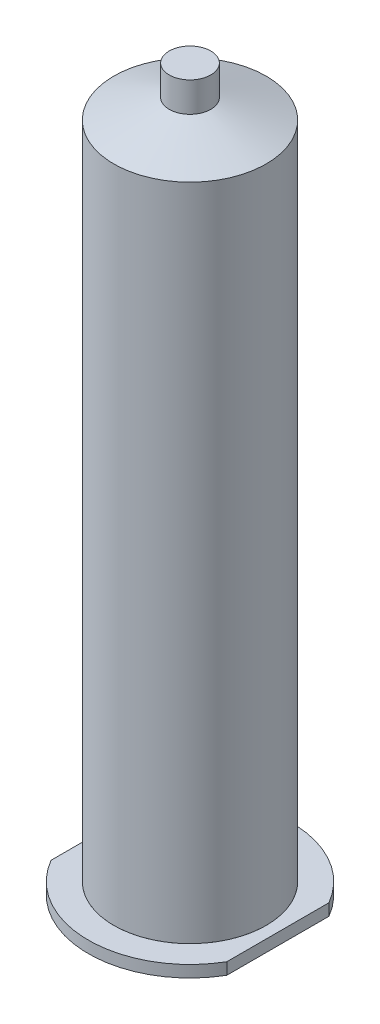
ISO-10303-21;
HEADER;
FILE_DESCRIPTION(('STEP AP214'),'2;1');
FILE_NAME('part.step','',(''),(''),'','','');
FILE_SCHEMA(('AUTOMOTIVE_DESIGN { 1 0 10303 214 1 1 1 1 }'));
ENDSEC;
DATA;
#1=APPLICATION_CONTEXT('core data for automotive mechanical design processes');
#2=APPLICATION_PROTOCOL_DEFINITION('international standard','automotive_design',2000,#1);
#3=PRODUCT_CONTEXT('',#1,'mechanical');
#4=PRODUCT('Part','Part','',(#3));
#5=PRODUCT_RELATED_PRODUCT_CATEGORY('part','',(#4));
#6=PRODUCT_DEFINITION_FORMATION('','',#4);
#7=PRODUCT_DEFINITION_CONTEXT('part definition',#1,'design');
#8=PRODUCT_DEFINITION('design','',#6,#7);
#9=PRODUCT_DEFINITION_SHAPE('','',#8);
#10=(LENGTH_UNIT() NAMED_UNIT(*) SI_UNIT(.MILLI.,.METRE.));
#11=(NAMED_UNIT(*) PLANE_ANGLE_UNIT() SI_UNIT($,.RADIAN.));
#12=(NAMED_UNIT(*) SI_UNIT($,.STERADIAN.) SOLID_ANGLE_UNIT());
#13=UNCERTAINTY_MEASURE_WITH_UNIT(LENGTH_MEASURE(1.E-05),#10,'distance_accuracy_value','');
#14=(GEOMETRIC_REPRESENTATION_CONTEXT(3) GLOBAL_UNCERTAINTY_ASSIGNED_CONTEXT((#13)) GLOBAL_UNIT_ASSIGNED_CONTEXT((#10,
#11,#12)) REPRESENTATION_CONTEXT('',''));
#15=CARTESIAN_POINT('',(0.,0.,0.));
#16=DIRECTION('',(0.,0.,1.));
#17=DIRECTION('',(1.,0.,0.));
#18=AXIS2_PLACEMENT_3D('',#15,#16,#17);
#19=CARTESIAN_POINT('',(20.185,-2.7,0.));
#20=DIRECTION('',(-1.,0.,0.));
#21=DIRECTION('',(0.,0.,1.));
#22=AXIS2_PLACEMENT_3D('',#19,#20,#21);
#23=PLANE('',#22);
#24=DIRECTION('',(0.,0.,1.));
#25=VECTOR('',#24,1.);
#26=CARTESIAN_POINT('',(20.185,0.,0.));
#27=LINE('',#26,#25);
#28=CARTESIAN_POINT('',(20.185,0.,-11.738325050875));
#29=VERTEX_POINT('',#28);
#30=CARTESIAN_POINT('',(20.185,0.,11.738325050875));
#31=VERTEX_POINT('',#30);
#32=EDGE_CURVE('E116',#29,#31,#27,.T.);
#33=ORIENTED_EDGE('',*,*,#32,.T.);
#34=DIRECTION('',(0.,1.,0.));
#35=VECTOR('',#34,1.);
#36=CARTESIAN_POINT('',(20.185,-2.7,11.738325050875));
#37=LINE('',#36,#35);
#38=CARTESIAN_POINT('',(20.185,-2.7,11.738325050875));
#39=VERTEX_POINT('',#38);
#40=EDGE_CURVE('E12',#39,#31,#37,.T.);
#41=ORIENTED_EDGE('',*,*,#40,.F.);
#42=DIRECTION('',(0.,0.,1.));
#43=VECTOR('',#42,1.);
#44=CARTESIAN_POINT('',(20.185,-2.7,0.));
#45=LINE('',#44,#43);
#46=CARTESIAN_POINT('',(20.185,-2.7,-11.738325050875));
#47=VERTEX_POINT('',#46);
#48=EDGE_CURVE('E99',#47,#39,#45,.T.);
#49=ORIENTED_EDGE('',*,*,#48,.F.);
#50=DIRECTION('',(0.,1.,0.));
#51=VECTOR('',#50,1.);
#52=CARTESIAN_POINT('',(20.185,-2.7,-11.738325050875));
#53=LINE('',#52,#51);
#54=EDGE_CURVE('E110',#47,#29,#53,.T.);
#55=ORIENTED_EDGE('',*,*,#54,.T.);
#56=EDGE_LOOP('',(#33,#41,#49,#55));
#57=FACE_BOUND('',#56,.T.);
#58=ADVANCED_FACE('F51',(#57),#23,.F.);
#59=CARTESIAN_POINT('',(0.,-2.7,0.));
#60=DIRECTION('',(0.,1.,0.));
#61=DIRECTION('',(0.,0.,1.));
#62=AXIS2_PLACEMENT_3D('',#59,#60,#61);
#63=CYLINDRICAL_SURFACE('',#62,23.35);
#64=CARTESIAN_POINT('',(0.,0.,0.));
#65=DIRECTION('',(0.,-1.,0.));
#66=DIRECTION('',(0.,0.,-1.));
#67=AXIS2_PLACEMENT_3D('',#64,#65,#66);
#68=CIRCLE('',#67,23.35);
#69=CARTESIAN_POINT('',(-20.185,0.,11.738325050875));
#70=VERTEX_POINT('',#69);
#71=EDGE_CURVE('E104',#31,#70,#68,.T.);
#72=ORIENTED_EDGE('',*,*,#71,.T.);
#73=DIRECTION('',(0.,1.,0.));
#74=VECTOR('',#73,1.);
#75=CARTESIAN_POINT('',(-20.185,-2.7,11.738325050875));
#76=LINE('',#75,#74);
#77=CARTESIAN_POINT('',(-20.185,-2.7,11.738325050875));
#78=VERTEX_POINT('',#77);
#79=EDGE_CURVE('E60',#78,#70,#76,.T.);
#80=ORIENTED_EDGE('',*,*,#79,.F.);
#81=CARTESIAN_POINT('',(0.,-2.7,0.));
#82=DIRECTION('',(0.,-1.,0.));
#83=DIRECTION('',(0.,0.,-1.));
#84=AXIS2_PLACEMENT_3D('',#81,#82,#83);
#85=CIRCLE('',#84,23.35);
#86=EDGE_CURVE('E94',#39,#78,#85,.T.);
#87=ORIENTED_EDGE('',*,*,#86,.F.);
#88=ORIENTED_EDGE('',*,*,#40,.T.);
#89=EDGE_LOOP('',(#72,#80,#87,#88));
#90=FACE_BOUND('',#89,.T.);
#91=ADVANCED_FACE('F103',(#90),#63,.T.);
#92=CARTESIAN_POINT('',(-20.185,-2.7,0.));
#93=DIRECTION('',(-1.,0.,0.));
#94=DIRECTION('',(0.,0.,1.));
#95=AXIS2_PLACEMENT_3D('',#92,#93,#94);
#96=PLANE('',#95);
#97=DIRECTION('',(0.,0.,1.));
#98=VECTOR('',#97,1.);
#99=CARTESIAN_POINT('',(-20.185,0.,0.));
#100=LINE('',#99,#98);
#101=CARTESIAN_POINT('',(-20.185,0.,-11.738325050875));
#102=VERTEX_POINT('',#101);
#103=EDGE_CURVE('E120',#102,#70,#100,.T.);
#104=ORIENTED_EDGE('',*,*,#103,.F.);
#105=DIRECTION('',(0.,1.,0.));
#106=VECTOR('',#105,1.);
#107=CARTESIAN_POINT('',(-20.185,-2.7,-11.738325050875));
#108=LINE('',#107,#106);
#109=CARTESIAN_POINT('',(-20.185,-2.7,-11.738325050875));
#110=VERTEX_POINT('',#109);
#111=EDGE_CURVE('E84',#110,#102,#108,.T.);
#112=ORIENTED_EDGE('',*,*,#111,.F.);
#113=DIRECTION('',(0.,0.,1.));
#114=VECTOR('',#113,1.);
#115=CARTESIAN_POINT('',(-20.185,-2.7,0.));
#116=LINE('',#115,#114);
#117=EDGE_CURVE('E97',#110,#78,#116,.T.);
#118=ORIENTED_EDGE('',*,*,#117,.T.);
#119=ORIENTED_EDGE('',*,*,#79,.T.);
#120=EDGE_LOOP('',(#104,#112,#118,#119));
#121=FACE_BOUND('',#120,.T.);
#122=ADVANCED_FACE('F108',(#121),#96,.T.);
#123=CARTESIAN_POINT('',(0.,-2.7,0.));
#124=DIRECTION('',(0.,1.,0.));
#125=DIRECTION('',(0.,0.,1.));
#126=AXIS2_PLACEMENT_3D('',#123,#124,#125);
#127=CYLINDRICAL_SURFACE('',#126,17.5);
#128=CARTESIAN_POINT('',(0.,-2.7,0.));
#129=DIRECTION('',(0.,-1.,0.));
#130=DIRECTION('',(0.,0.,-1.));
#131=AXIS2_PLACEMENT_3D('',#128,#129,#130);
#132=CIRCLE('',#131,17.5);
#133=CARTESIAN_POINT('',(0.,-2.7,17.5));
#134=VERTEX_POINT('',#133);
#135=EDGE_CURVE('E127',#134,#134,#132,.T.);
#136=CARTESIAN_POINT('',(0.,0.,0.));
#137=DIRECTION('',(0.,-1.,0.));
#138=DIRECTION('',(0.,0.,-1.));
#139=AXIS2_PLACEMENT_3D('',#136,#137,#138);
#140=CIRCLE('',#139,17.5);
#141=CARTESIAN_POINT('',(0.,0.,17.5));
#142=VERTEX_POINT('',#141);
#143=EDGE_CURVE('E113',#142,#142,#140,.T.);
#144=CARTESIAN_POINT('',(0.,-2.7,17.5));
#145=CARTESIAN_POINT('',(0.,-2.671875,17.5));
#146=CARTESIAN_POINT('',(0.,-2.64375,17.5));
#147=CARTESIAN_POINT('',(0.,-2.5875,17.5));
#148=CARTESIAN_POINT('',(0.,-2.559375,17.5));
#149=CARTESIAN_POINT('',(0.,-2.503125,17.5));
#150=CARTESIAN_POINT('',(0.,-2.475,17.5));
#151=CARTESIAN_POINT('',(0.,-2.41875,17.5));
#152=CARTESIAN_POINT('',(0.,-2.390625,17.5));
#153=CARTESIAN_POINT('',(0.,-2.334375,17.5));
#154=CARTESIAN_POINT('',(0.,-2.30625,17.5));
#155=CARTESIAN_POINT('',(0.,-2.25,17.5));
#156=CARTESIAN_POINT('',(0.,-2.221875,17.5));
#157=CARTESIAN_POINT('',(0.,-2.165625,17.5));
#158=CARTESIAN_POINT('',(0.,-2.1375,17.5));
#159=CARTESIAN_POINT('',(0.,-2.08125,17.5));
#160=CARTESIAN_POINT('',(0.,-2.053125,17.5));
#161=CARTESIAN_POINT('',(0.,-1.996875,17.5));
#162=CARTESIAN_POINT('',(0.,-1.96875,17.5));
#163=CARTESIAN_POINT('',(0.,-1.9125,17.5));
#164=CARTESIAN_POINT('',(0.,-1.884375,17.5));
#165=CARTESIAN_POINT('',(0.,-1.828125,17.5));
#166=CARTESIAN_POINT('',(0.,-1.8,17.5));
#167=CARTESIAN_POINT('',(0.,-1.74375,17.5));
#168=CARTESIAN_POINT('',(0.,-1.715625,17.5));
#169=CARTESIAN_POINT('',(0.,-1.659375,17.5));
#170=CARTESIAN_POINT('',(0.,-1.63125,17.5));
#171=CARTESIAN_POINT('',(0.,-1.575,17.5));
#172=CARTESIAN_POINT('',(0.,-1.546875,17.5));
#173=CARTESIAN_POINT('',(0.,-1.490625,17.5));
#174=CARTESIAN_POINT('',(0.,-1.4625,17.5));
#175=CARTESIAN_POINT('',(0.,-1.40625,17.5));
#176=CARTESIAN_POINT('',(0.,-1.378125,17.5));
#177=CARTESIAN_POINT('',(0.,-1.321875,17.5));
#178=CARTESIAN_POINT('',(0.,-1.29375,17.5));
#179=CARTESIAN_POINT('',(0.,-1.2375,17.5));
#180=CARTESIAN_POINT('',(0.,-1.209375,17.5));
#181=CARTESIAN_POINT('',(0.,-1.153125,17.5));
#182=CARTESIAN_POINT('',(0.,-1.125,17.5));
#183=CARTESIAN_POINT('',(0.,-1.06875,17.5));
#184=CARTESIAN_POINT('',(0.,-1.040625,17.5));
#185=CARTESIAN_POINT('',(0.,-0.984375,17.5));
#186=CARTESIAN_POINT('',(0.,-0.956249999999999,17.5));
#187=CARTESIAN_POINT('',(0.,-0.899999999999999,17.5));
#188=CARTESIAN_POINT('',(0.,-0.871875,17.5));
#189=CARTESIAN_POINT('',(0.,-0.815624999999999,17.5));
#190=CARTESIAN_POINT('',(0.,-0.787499999999999,17.5));
#191=CARTESIAN_POINT('',(0.,-0.73125,17.5));
#192=CARTESIAN_POINT('',(0.,-0.703125,17.5));
#193=CARTESIAN_POINT('',(0.,-0.646875,17.5));
#194=CARTESIAN_POINT('',(0.,-0.61875,17.5));
#195=CARTESIAN_POINT('',(0.,-0.5625,17.5));
#196=CARTESIAN_POINT('',(0.,-0.534375,17.5));
#197=CARTESIAN_POINT('',(0.,-0.478125,17.5));
#198=CARTESIAN_POINT('',(0.,-0.45,17.5));
#199=CARTESIAN_POINT('',(0.,-0.39375,17.5));
#200=CARTESIAN_POINT('',(0.,-0.365625,17.5));
#201=CARTESIAN_POINT('',(0.,-0.309375,17.5));
#202=CARTESIAN_POINT('',(0.,-0.28125,17.5));
#203=CARTESIAN_POINT('',(0.,-0.225,17.5));
#204=CARTESIAN_POINT('',(0.,-0.196875,17.5));
#205=CARTESIAN_POINT('',(0.,-0.140625,17.5));
#206=CARTESIAN_POINT('',(0.,-0.1125,17.5));
#207=CARTESIAN_POINT('',(0.,-0.0562499999999997,17.5));
#208=CARTESIAN_POINT('',(0.,-0.0281249999999996,17.5));
#209=CARTESIAN_POINT('',(0.,0.,17.5));
#210=B_SPLINE_CURVE_WITH_KNOTS('',3,(#144,#145,#146,#147,#148,#149,#150,#151,#152,#153,#154,
#155,#156,#157,#158,#159,#160,#161,#162,#163,#164,#165,#166,#167,#168,#169,#170,#171,#172,#173,
#174,#175,#176,#177,#178,#179,#180,#181,#182,#183,#184,#185,#186,#187,#188,#189,#190,#191,#192,
#193,#194,#195,#196,#197,#198,#199,#200,#201,#202,#203,#204,#205,#206,#207,#208,#209),
.UNSPECIFIED.,.F.,.F.,(4,2,2,2,2,2,2,2,2,2,2,2,2,2,2,2,2,2,2,2,2,2,2,2,2,2,2,2,2,2,2,2,4),(0.,
0.0843750000000003,0.16875,0.253125,0.3375,0.421875,0.50625,0.590625,0.675,0.759375,0.84375,
0.928125000000001,1.0125,1.096875,1.18125,1.265625,1.35,1.434375,1.51875,1.603125,1.6875,
1.771875,1.85625,1.940625,2.025,2.109375,2.19375,2.278125,2.3625,2.446875,2.53125,2.615625,2.7),.UNSPECIFIED.);
#211=EDGE_CURVE('BSEAM53',#134,#142,#210,.T.);
#212=ORIENTED_EDGE('',*,*,#135,.T.);
#213=ORIENTED_EDGE('',*,*,#143,.F.);
#214=ORIENTED_EDGE('',*,*,#211,.T.);
#215=ORIENTED_EDGE('',*,*,#211,.F.);
#216=EDGE_LOOP('',(#212,#214,#213,#215));
#217=FACE_BOUND('',#216,.T.);
#218=ADVANCED_FACE('F53',(#217),#127,.F.);
#219=EDGE_CURVE('E87',#102,#29,#68,.T.);
#220=ORIENTED_EDGE('',*,*,#219,.T.);
#221=ORIENTED_EDGE('',*,*,#54,.F.);
#222=EDGE_CURVE('E68',#110,#47,#85,.T.);
#223=ORIENTED_EDGE('',*,*,#222,.F.);
#224=ORIENTED_EDGE('',*,*,#111,.T.);
#225=EDGE_LOOP('',(#220,#221,#223,#224));
#226=FACE_BOUND('',#225,.T.);
#227=ADVANCED_FACE('F135',(#226),#63,.T.);
#228=CARTESIAN_POINT('',(0.,-2.7,0.));
#229=DIRECTION('',(0.,-1.,0.));
#230=DIRECTION('',(0.,0.,-1.));
#231=AXIS2_PLACEMENT_3D('',#228,#229,#230);
#232=PLANE('',#231);
#233=ORIENTED_EDGE('',*,*,#135,.F.);
#234=EDGE_LOOP('',(#233));
#235=FACE_BOUND('',#234,.T.);
#236=ORIENTED_EDGE('',*,*,#48,.T.);
#237=ORIENTED_EDGE('',*,*,#86,.T.);
#238=ORIENTED_EDGE('',*,*,#117,.F.);
#239=ORIENTED_EDGE('',*,*,#222,.T.);
#240=EDGE_LOOP('',(#236,#237,#238,#239));
#241=FACE_BOUND('',#240,.T.);
#242=ADVANCED_FACE('F95',(#235,#241),#232,.T.);
#243=CARTESIAN_POINT('',(0.,0.,0.));
#244=DIRECTION('',(0.,-1.,0.));
#245=DIRECTION('',(0.,0.,-1.));
#246=AXIS2_PLACEMENT_3D('',#243,#244,#245);
#247=PLANE('',#246);
#248=ORIENTED_EDGE('',*,*,#143,.T.);
#249=EDGE_LOOP('',(#248));
#250=FACE_BOUND('',#249,.T.);
#251=ORIENTED_EDGE('',*,*,#32,.F.);
#252=ORIENTED_EDGE('',*,*,#219,.F.);
#253=ORIENTED_EDGE('',*,*,#103,.T.);
#254=ORIENTED_EDGE('',*,*,#71,.F.);
#255=EDGE_LOOP('',(#251,#252,#253,#254));
#256=FACE_BOUND('',#255,.T.);
#257=ADVANCED_FACE('F126',(#250,#256),#247,.F.);
#258=CLOSED_SHELL('',(#58,#91,#122,#218,#227,#242,#257));
#259=MANIFOLD_SOLID_BREP('B2',#258);
#260=CARTESIAN_POINT('',(0.,0.,0.));
#261=DIRECTION('',(0.,-1.,0.));
#262=DIRECTION('',(0.,0.,-1.));
#263=AXIS2_PLACEMENT_3D('',#260,#261,#262);
#264=CYLINDRICAL_SURFACE('',#263,17.5);
#265=CARTESIAN_POINT('',(0.,151.5,0.));
#266=DIRECTION('',(0.,-1.,0.));
#267=DIRECTION('',(0.,0.,-1.));
#268=AXIS2_PLACEMENT_3D('',#265,#266,#267);
#269=CIRCLE('',#268,17.5);
#270=CARTESIAN_POINT('',(0.,151.5,-17.4999999999999));
#271=VERTEX_POINT('',#270);
#272=EDGE_CURVE('E50',#271,#271,#269,.T.);
#273=ORIENTED_EDGE('',*,*,#272,.T.);
#274=EDGE_LOOP('',(#273));
#275=FACE_BOUND('',#274,.T.);
#276=CARTESIAN_POINT('',(0.,0.,0.));
#277=DIRECTION('',(0.,-1.,0.));
#278=DIRECTION('',(0.,0.,-1.));
#279=AXIS2_PLACEMENT_3D('',#276,#277,#278);
#280=CIRCLE('',#279,17.5);
#281=CARTESIAN_POINT('',(0.,0.,-17.5));
#282=VERTEX_POINT('',#281);
#283=EDGE_CURVE('E210',#282,#282,#280,.T.);
#284=ORIENTED_EDGE('',*,*,#283,.F.);
#285=EDGE_LOOP('',(#284));
#286=FACE_BOUND('',#285,.T.);
#287=ADVANCED_FACE('F193',(#275,#286),#264,.T.);
#288=CARTESIAN_POINT('',(0.,156.,0.));
#289=DIRECTION('',(0.,-1.,0.));
#290=DIRECTION('',(0.,0.,-1.));
#291=AXIS2_PLACEMENT_3D('',#288,#289,#290);
#292=CONICAL_SURFACE('',#291,4.775,1.23088725295115);
#293=CARTESIAN_POINT('',(0.,156.,0.));
#294=DIRECTION('',(0.,-1.,0.));
#295=DIRECTION('',(0.,0.,-1.));
#296=AXIS2_PLACEMENT_3D('',#293,#294,#295);
#297=CIRCLE('',#296,4.775);
#298=CARTESIAN_POINT('',(0.,156.,-4.77499999999996));
#299=VERTEX_POINT('',#298);
#300=EDGE_CURVE('E200',#299,#299,#297,.T.);
#301=CARTESIAN_POINT('',(0.,151.5,-17.4999999999999));
#302=CARTESIAN_POINT('',(0.,151.546875,-17.3674479166666));
#303=CARTESIAN_POINT('',(0.,151.59375,-17.2348958333333));
#304=CARTESIAN_POINT('',(0.,151.6875,-16.9697916666666));
#305=CARTESIAN_POINT('',(0.,151.734375,-16.8372395833333));
#306=CARTESIAN_POINT('',(0.,151.828125,-16.5721354166666));
#307=CARTESIAN_POINT('',(0.,151.875,-16.4395833333333));
#308=CARTESIAN_POINT('',(0.,151.96875,-16.1744791666666));
#309=CARTESIAN_POINT('',(0.,152.015625,-16.0419270833333));
#310=CARTESIAN_POINT('',(0.,152.109375,-15.7768229166666));
#311=CARTESIAN_POINT('',(0.,152.15625,-15.6442708333333));
#312=CARTESIAN_POINT('',(0.,152.25,-15.3791666666666));
#313=CARTESIAN_POINT('',(0.,152.296875,-15.2466145833333));
#314=CARTESIAN_POINT('',(0.,152.390625,-14.9815104166666));
#315=CARTESIAN_POINT('',(0.,152.4375,-14.8489583333333));
#316=CARTESIAN_POINT('',(0.,152.53125,-14.5838541666666));
#317=CARTESIAN_POINT('',(0.,152.578125,-14.4513020833333));
#318=CARTESIAN_POINT('',(0.,152.671875,-14.1861979166666));
#319=CARTESIAN_POINT('',(0.,152.71875,-14.0536458333333));
#320=CARTESIAN_POINT('',(0.,152.8125,-13.7885416666666));
#321=CARTESIAN_POINT('',(0.,152.859375,-13.6559895833333));
#322=CARTESIAN_POINT('',(0.,152.953125,-13.3908854166666));
#323=CARTESIAN_POINT('',(0.,153.,-13.2583333333333));
#324=CARTESIAN_POINT('',(0.,153.09375,-12.9932291666666));
#325=CARTESIAN_POINT('',(0.,153.140625,-12.8606770833333));
#326=CARTESIAN_POINT('',(0.,153.234375,-12.5955729166666));
#327=CARTESIAN_POINT('',(0.,153.28125,-12.4630208333333));
#328=CARTESIAN_POINT('',(0.,153.375,-12.1979166666666));
#329=CARTESIAN_POINT('',(0.,153.421875,-12.0653645833333));
#330=CARTESIAN_POINT('',(0.,153.515625,-11.8002604166666));
#331=CARTESIAN_POINT('',(0.,153.5625,-11.6677083333333));
#332=CARTESIAN_POINT('',(0.,153.65625,-11.4026041666666));
#333=CARTESIAN_POINT('',(0.,153.703125,-11.2700520833333));
#334=CARTESIAN_POINT('',(0.,153.796875,-11.0049479166666));
#335=CARTESIAN_POINT('',(0.,153.84375,-10.8723958333333));
#336=CARTESIAN_POINT('',(0.,153.9375,-10.6072916666666));
#337=CARTESIAN_POINT('',(0.,153.984375,-10.4747395833333));
#338=CARTESIAN_POINT('',(0.,154.078125,-10.2096354166666));
#339=CARTESIAN_POINT('',(0.,154.125,-10.0770833333333));
#340=CARTESIAN_POINT('',(0.,154.21875,-9.81197916666662));
#341=CARTESIAN_POINT('',(0.,154.265625,-9.67942708333328));
#342=CARTESIAN_POINT('',(0.,154.359375,-9.41432291666662));
#343=CARTESIAN_POINT('',(0.,154.40625,-9.28177083333328));
#344=CARTESIAN_POINT('',(0.,154.5,-9.01666666666662));
#345=CARTESIAN_POINT('',(0.,154.546875,-8.88411458333329));
#346=CARTESIAN_POINT('',(0.,154.640625,-8.61901041666662));
#347=CARTESIAN_POINT('',(0.,154.6875,-8.48645833333329));
#348=CARTESIAN_POINT('',(0.,154.78125,-8.22135416666662));
#349=CARTESIAN_POINT('',(0.,154.828125,-8.08880208333329));
#350=CARTESIAN_POINT('',(0.,154.921875,-7.82369791666662));
#351=CARTESIAN_POINT('',(0.,154.96875,-7.69114583333329));
#352=CARTESIAN_POINT('',(0.,155.0625,-7.42604166666662));
#353=CARTESIAN_POINT('',(0.,155.109375,-7.29348958333329));
#354=CARTESIAN_POINT('',(0.,155.203125,-7.02838541666662));
#355=CARTESIAN_POINT('',(0.,155.25,-6.89583333333329));
#356=CARTESIAN_POINT('',(0.,155.34375,-6.63072916666663));
#357=CARTESIAN_POINT('',(0.,155.390625,-6.49817708333329));
#358=CARTESIAN_POINT('',(0.,155.484375,-6.23307291666662));
#359=CARTESIAN_POINT('',(0.,155.53125,-6.10052083333329));
#360=CARTESIAN_POINT('',(0.,155.625,-5.83541666666663));
#361=CARTESIAN_POINT('',(0.,155.671875,-5.70286458333329));
#362=CARTESIAN_POINT('',(0.,155.765625,-5.43776041666663));
#363=CARTESIAN_POINT('',(0.,155.8125,-5.3052083333333));
#364=CARTESIAN_POINT('',(0.,155.90625,-5.04010416666663));
#365=CARTESIAN_POINT('',(0.,155.953125,-4.9075520833333));
#366=CARTESIAN_POINT('',(0.,156.,-4.77499999999996));
#367=B_SPLINE_CURVE_WITH_KNOTS('',3,(#301,#302,#303,#304,#305,#306,#307,#308,#309,#310,#311,
#312,#313,#314,#315,#316,#317,#318,#319,#320,#321,#322,#323,#324,#325,#326,#327,#328,#329,#330,
#331,#332,#333,#334,#335,#336,#337,#338,#339,#340,#341,#342,#343,#344,#345,#346,#347,#348,#349,
#350,#351,#352,#353,#354,#355,#356,#357,#358,#359,#360,#361,#362,#363,#364,#365,#366),
.UNSPECIFIED.,.F.,.F.,(4,2,2,2,2,2,2,2,2,2,2,2,2,2,2,2,2,2,2,2,2,2,2,2,2,2,2,2,2,2,2,2,4),(0.,
0.421788909039881,0.843577818079778,1.26536672711967,1.68715563615956,2.10894454519945,
2.53073345423934,2.95252236327923,3.37431127231912,3.79610018135902,4.2178890903989,
4.63967799943879,5.06146690847869,5.48325581751858,5.90504472655847,6.32683363559836,
6.74862254463825,7.17041145367815,7.59220036271804,8.01398927175793,8.43577818079782,
8.85756708983771,9.2793559988776,9.70114490791749,10.1229338169574,10.5447227259973,
10.9665116350372,11.3883005440771,11.8100894531169,12.2318783621568,12.6536672711967,
13.0754561802366,13.4972450892765),.UNSPECIFIED.);
#368=EDGE_CURVE('BSEAM250',#271,#299,#367,.T.);
#369=ORIENTED_EDGE('',*,*,#272,.F.);
#370=ORIENTED_EDGE('',*,*,#300,.T.);
#371=ORIENTED_EDGE('',*,*,#368,.T.);
#372=ORIENTED_EDGE('',*,*,#368,.F.);
#373=EDGE_LOOP('',(#369,#371,#370,#372));
#374=FACE_BOUND('',#373,.T.);
#375=ADVANCED_FACE('F250',(#374),#292,.T.);
#376=CARTESIAN_POINT('',(0.,0.,0.));
#377=DIRECTION('',(0.,-1.,0.));
#378=DIRECTION('',(0.,0.,-1.));
#379=AXIS2_PLACEMENT_3D('',#376,#377,#378);
#380=CYLINDRICAL_SURFACE('',#379,4.775);
#381=CARTESIAN_POINT('',(0.,162.85,0.));
#382=DIRECTION('',(0.,-1.,0.));
#383=DIRECTION('',(0.,0.,-1.));
#384=AXIS2_PLACEMENT_3D('',#381,#382,#383);
#385=CIRCLE('',#384,4.775);
#386=CARTESIAN_POINT('',(0.,162.85,-4.775));
#387=VERTEX_POINT('',#386);
#388=EDGE_CURVE('E205',#387,#387,#385,.T.);
#389=ORIENTED_EDGE('',*,*,#388,.T.);
#390=EDGE_LOOP('',(#389));
#391=FACE_BOUND('',#390,.T.);
#392=ORIENTED_EDGE('',*,*,#300,.F.);
#393=EDGE_LOOP('',(#392));
#394=FACE_BOUND('',#393,.T.);
#395=ADVANCED_FACE('F254',(#391,#394),#380,.T.);
#396=CARTESIAN_POINT('',(0.,162.85,0.));
#397=DIRECTION('',(0.,1.,0.));
#398=DIRECTION('',(0.,0.,1.));
#399=AXIS2_PLACEMENT_3D('',#396,#397,#398);
#400=PLANE('',#399);
#401=ORIENTED_EDGE('',*,*,#388,.F.);
#402=EDGE_LOOP('',(#401));
#403=FACE_BOUND('',#402,.T.);
#404=ADVANCED_FACE('F245',(#403),#400,.T.);
#405=CARTESIAN_POINT('',(0.,0.,0.));
#406=DIRECTION('',(0.,-1.,0.));
#407=DIRECTION('',(0.,0.,-1.));
#408=AXIS2_PLACEMENT_3D('',#405,#406,#407);
#409=PLANE('',#408);
#410=CARTESIAN_POINT('',(0.,0.,0.));
#411=DIRECTION('',(0.,-1.,0.));
#412=DIRECTION('',(0.,0.,-1.));
#413=AXIS2_PLACEMENT_3D('',#410,#411,#412);
#414=CIRCLE('',#413,13.5);
#415=CARTESIAN_POINT('',(0.,0.,-13.5));
#416=VERTEX_POINT('',#415);
#417=EDGE_CURVE('E217',#416,#416,#414,.T.);
#418=ORIENTED_EDGE('',*,*,#417,.F.);
#419=EDGE_LOOP('',(#418));
#420=FACE_BOUND('',#419,.T.);
#421=ORIENTED_EDGE('',*,*,#283,.T.);
#422=EDGE_LOOP('',(#421));
#423=FACE_BOUND('',#422,.T.);
#424=ADVANCED_FACE('F239',(#420,#423),#409,.T.);
#425=CARTESIAN_POINT('',(0.,0.,0.));
#426=DIRECTION('',(0.,-1.,0.));
#427=DIRECTION('',(0.,0.,-1.));
#428=AXIS2_PLACEMENT_3D('',#425,#426,#427);
#429=CYLINDRICAL_SURFACE('',#428,13.5);
#430=CARTESIAN_POINT('',(0.,148.671789362899,0.));
#431=DIRECTION('',(0.,-1.,0.));
#432=DIRECTION('',(0.,0.,-1.));
#433=AXIS2_PLACEMENT_3D('',#430,#431,#432);
#434=CIRCLE('',#433,13.5);
#435=CARTESIAN_POINT('',(0.,148.671789362899,-13.5));
#436=VERTEX_POINT('',#435);
#437=EDGE_CURVE('E216',#436,#436,#434,.T.);
#438=ORIENTED_EDGE('',*,*,#437,.F.);
#439=EDGE_LOOP('',(#438));
#440=FACE_BOUND('',#439,.T.);
#441=ORIENTED_EDGE('',*,*,#417,.T.);
#442=EDGE_LOOP('',(#441));
#443=FACE_BOUND('',#442,.T.);
#444=ADVANCED_FACE('F236',(#440,#443),#429,.F.);
#445=CARTESIAN_POINT('',(0.,152.228860062678,0.));
#446=DIRECTION('',(0.,-1.,0.));
#447=DIRECTION('',(0.,0.,-1.));
#448=AXIS2_PLACEMENT_3D('',#445,#446,#447);
#449=CONICAL_SURFACE('',#448,3.44139452118264,1.23088725295115);
#450=CARTESIAN_POINT('',(0.,153.171789362899,0.));
#451=DIRECTION('',(0.,-1.,0.));
#452=DIRECTION('',(0.,0.,-1.));
#453=AXIS2_PLACEMENT_3D('',#450,#451,#452);
#454=CIRCLE('',#453,0.775000000000001);
#455=CARTESIAN_POINT('',(0.,153.171789362899,-0.77499999999999));
#456=VERTEX_POINT('',#455);
#457=EDGE_CURVE('E225',#456,#456,#454,.T.);
#458=CARTESIAN_POINT('',(0.,148.671789362899,-13.5));
#459=CARTESIAN_POINT('',(0.,148.718664362899,-13.3674479166666));
#460=CARTESIAN_POINT('',(0.,148.765539362899,-13.2348958333333));
#461=CARTESIAN_POINT('',(0.,148.859289362899,-12.9697916666666));
#462=CARTESIAN_POINT('',(0.,148.906164362899,-12.8372395833333));
#463=CARTESIAN_POINT('',(0.,148.999914362899,-12.5721354166666));
#464=CARTESIAN_POINT('',(0.,149.046789362899,-12.4395833333333));
#465=CARTESIAN_POINT('',(0.,149.140539362899,-12.1744791666666));
#466=CARTESIAN_POINT('',(0.,149.187414362899,-12.0419270833333));
#467=CARTESIAN_POINT('',(0.,149.281164362899,-11.7768229166666));
#468=CARTESIAN_POINT('',(0.,149.328039362899,-11.6442708333333));
#469=CARTESIAN_POINT('',(0.,149.421789362899,-11.3791666666666));
#470=CARTESIAN_POINT('',(0.,149.468664362899,-11.2466145833333));
#471=CARTESIAN_POINT('',(0.,149.562414362899,-10.9815104166666));
#472=CARTESIAN_POINT('',(0.,149.609289362899,-10.8489583333333));
#473=CARTESIAN_POINT('',(0.,149.703039362899,-10.5838541666666));
#474=CARTESIAN_POINT('',(0.,149.749914362899,-10.4513020833333));
#475=CARTESIAN_POINT('',(0.,149.843664362899,-10.1861979166666));
#476=CARTESIAN_POINT('',(0.,149.890539362899,-10.0536458333333));
#477=CARTESIAN_POINT('',(0.,149.984289362899,-9.78854166666664));
#478=CARTESIAN_POINT('',(0.,150.031164362899,-9.6559895833333));
#479=CARTESIAN_POINT('',(0.,150.124914362899,-9.39088541666664));
#480=CARTESIAN_POINT('',(0.,150.171789362899,-9.2583333333333));
#481=CARTESIAN_POINT('',(0.,150.265539362899,-8.99322916666664));
#482=CARTESIAN_POINT('',(0.,150.312414362899,-8.86067708333331));
#483=CARTESIAN_POINT('',(0.,150.406164362899,-8.59557291666664));
#484=CARTESIAN_POINT('',(0.,150.453039362899,-8.46302083333331));
#485=CARTESIAN_POINT('',(0.,150.546789362899,-8.19791666666664));
#486=CARTESIAN_POINT('',(0.,150.593664362899,-8.06536458333331));
#487=CARTESIAN_POINT('',(0.,150.687414362899,-7.80026041666664));
#488=CARTESIAN_POINT('',(0.,150.734289362899,-7.66770833333331));
#489=CARTESIAN_POINT('',(0.,150.828039362899,-7.40260416666664));
#490=CARTESIAN_POINT('',(0.,150.874914362899,-7.27005208333331));
#491=CARTESIAN_POINT('',(0.,150.968664362899,-7.00494791666664));
#492=CARTESIAN_POINT('',(0.,151.015539362899,-6.87239583333331));
#493=CARTESIAN_POINT('',(0.,151.109289362899,-6.60729166666664));
#494=CARTESIAN_POINT('',(0.,151.156164362899,-6.47473958333331));
#495=CARTESIAN_POINT('',(0.,151.249914362899,-6.20963541666665));
#496=CARTESIAN_POINT('',(0.,151.296789362899,-6.07708333333331));
#497=CARTESIAN_POINT('',(0.,151.390539362899,-5.81197916666664));
#498=CARTESIAN_POINT('',(0.,151.437414362899,-5.67942708333331));
#499=CARTESIAN_POINT('',(0.,151.531164362899,-5.41432291666665));
#500=CARTESIAN_POINT('',(0.,151.578039362899,-5.28177083333331));
#501=CARTESIAN_POINT('',(0.,151.671789362899,-5.01666666666665));
#502=CARTESIAN_POINT('',(0.,151.718664362899,-4.88411458333332));
#503=CARTESIAN_POINT('',(0.,151.812414362899,-4.61901041666665));
#504=CARTESIAN_POINT('',(0.,151.859289362899,-4.48645833333331));
#505=CARTESIAN_POINT('',(0.,151.953039362899,-4.22135416666665));
#506=CARTESIAN_POINT('',(0.,151.999914362899,-4.08880208333331));
#507=CARTESIAN_POINT('',(0.,152.093664362899,-3.82369791666665));
#508=CARTESIAN_POINT('',(0.,152.140539362899,-3.69114583333332));
#509=CARTESIAN_POINT('',(0.,152.234289362899,-3.42604166666665));
#510=CARTESIAN_POINT('',(0.,152.281164362899,-3.29348958333332));
#511=CARTESIAN_POINT('',(0.,152.374914362899,-3.02838541666665));
#512=CARTESIAN_POINT('',(0.,152.421789362899,-2.89583333333332));
#513=CARTESIAN_POINT('',(0.,152.515539362899,-2.63072916666665));
#514=CARTESIAN_POINT('',(0.,152.562414362899,-2.49817708333332));
#515=CARTESIAN_POINT('',(0.,152.656164362899,-2.23307291666665));
#516=CARTESIAN_POINT('',(0.,152.703039362899,-2.10052083333332));
#517=CARTESIAN_POINT('',(0.,152.796789362899,-1.83541666666665));
#518=CARTESIAN_POINT('',(0.,152.843664362899,-1.70286458333332));
#519=CARTESIAN_POINT('',(0.,152.937414362899,-1.43776041666665));
#520=CARTESIAN_POINT('',(0.,152.984289362899,-1.30520833333332));
#521=CARTESIAN_POINT('',(0.,153.078039362899,-1.04010416666666));
#522=CARTESIAN_POINT('',(0.,153.124914362899,-0.907552083333326));
#523=CARTESIAN_POINT('',(0.,153.171789362899,-0.77499999999999));
#524=B_SPLINE_CURVE_WITH_KNOTS('',3,(#458,#459,#460,#461,#462,#463,#464,#465,#466,#467,#468,
#469,#470,#471,#472,#473,#474,#475,#476,#477,#478,#479,#480,#481,#482,#483,#484,#485,#486,#487,
#488,#489,#490,#491,#492,#493,#494,#495,#496,#497,#498,#499,#500,#501,#502,#503,#504,#505,#506,
#507,#508,#509,#510,#511,#512,#513,#514,#515,#516,#517,#518,#519,#520,#521,#522,#523),
.UNSPECIFIED.,.F.,.F.,(4,2,2,2,2,2,2,2,2,2,2,2,2,2,2,2,2,2,2,2,2,2,2,2,2,2,2,2,2,2,2,2,4),(0.,
0.421788909039884,0.843577818079778,1.26536672711967,1.68715563615956,2.10894454519945,
2.53073345423934,2.95252236327923,3.37431127231913,3.79610018135902,4.2178890903989,
4.6396779994388,5.06146690847869,5.48325581751859,5.90504472655847,6.32683363559836,
6.74862254463826,7.17041145367815,7.59220036271804,8.01398927175793,8.43577818079782,
8.85756708983771,9.27935599887761,9.70114490791749,10.1229338169574,10.5447227259973,
10.9665116350372,11.3883005440771,11.8100894531169,12.2318783621568,12.6536672711967,
13.0754561802366,13.4972450892765),.UNSPECIFIED.);
#525=EDGE_CURVE('BSEAM233',#436,#456,#524,.T.);
#526=ORIENTED_EDGE('',*,*,#437,.T.);
#527=ORIENTED_EDGE('',*,*,#457,.F.);
#528=ORIENTED_EDGE('',*,*,#525,.T.);
#529=ORIENTED_EDGE('',*,*,#525,.F.);
#530=EDGE_LOOP('',(#526,#528,#527,#529));
#531=FACE_BOUND('',#530,.T.);
#532=ADVANCED_FACE('F233',(#531),#449,.F.);
#533=CARTESIAN_POINT('',(0.,0.,0.));
#534=DIRECTION('',(0.,-1.,0.));
#535=DIRECTION('',(0.,0.,-1.));
#536=AXIS2_PLACEMENT_3D('',#533,#534,#535);
#537=CYLINDRICAL_SURFACE('',#536,0.775000000000001);
#538=CARTESIAN_POINT('',(0.,158.85,0.));
#539=DIRECTION('',(0.,1.,0.));
#540=DIRECTION('',(0.,0.,1.));
#541=AXIS2_PLACEMENT_3D('',#538,#539,#540);
#542=CIRCLE('',#541,0.775000000000001);
#543=CARTESIAN_POINT('',(0.,158.85,0.775000000000001));
#544=VERTEX_POINT('',#543);
#545=EDGE_CURVE('E221',#544,#544,#542,.F.);
#546=ORIENTED_EDGE('',*,*,#545,.F.);
#547=EDGE_LOOP('',(#546));
#548=FACE_BOUND('',#547,.T.);
#549=ORIENTED_EDGE('',*,*,#457,.T.);
#550=EDGE_LOOP('',(#549));
#551=FACE_BOUND('',#550,.T.);
#552=ADVANCED_FACE('F268',(#548,#551),#537,.F.);
#553=CARTESIAN_POINT('',(0.,158.85,0.));
#554=DIRECTION('',(0.,1.,0.));
#555=DIRECTION('',(0.,0.,1.));
#556=AXIS2_PLACEMENT_3D('',#553,#554,#555);
#557=PLANE('',#556);
#558=ORIENTED_EDGE('',*,*,#545,.T.);
#559=EDGE_LOOP('',(#558));
#560=FACE_BOUND('',#559,.T.);
#561=ADVANCED_FACE('F265',(#560),#557,.F.);
#562=CLOSED_SHELL('',(#287,#375,#395,#404,#424,#444,#532,#552,#561));
#563=MANIFOLD_SOLID_BREP('B6',#562);
#564=ADVANCED_BREP_SHAPE_REPRESENTATION('',(#18,#259,#563),#14);
#565=SHAPE_DEFINITION_REPRESENTATION(#9,#564);
ENDSEC;
END-ISO-10303-21;
